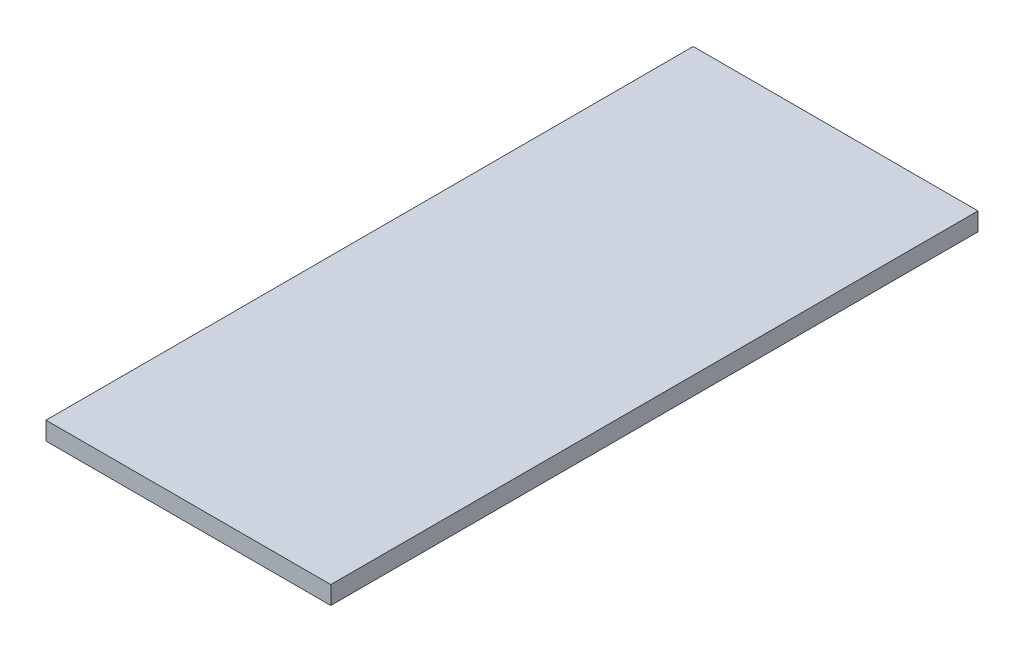
ISO-10303-21;
HEADER;
FILE_DESCRIPTION(('STEP AP214'),'2;1');
FILE_NAME('part.step','',(''),(''),'','','');
FILE_SCHEMA(('AUTOMOTIVE_DESIGN { 1 0 10303 214 1 1 1 1 }'));
ENDSEC;
DATA;
#1=APPLICATION_CONTEXT('core data for automotive mechanical design processes');
#2=APPLICATION_PROTOCOL_DEFINITION('international standard','automotive_design',2000,#1);
#3=PRODUCT_CONTEXT('',#1,'mechanical');
#4=PRODUCT('Part','Part','',(#3));
#5=PRODUCT_RELATED_PRODUCT_CATEGORY('part','',(#4));
#6=PRODUCT_DEFINITION_FORMATION('','',#4);
#7=PRODUCT_DEFINITION_CONTEXT('part definition',#1,'design');
#8=PRODUCT_DEFINITION('design','',#6,#7);
#9=PRODUCT_DEFINITION_SHAPE('','',#8);
#10=(LENGTH_UNIT() NAMED_UNIT(*) SI_UNIT(.MILLI.,.METRE.));
#11=(NAMED_UNIT(*) PLANE_ANGLE_UNIT() SI_UNIT($,.RADIAN.));
#12=(NAMED_UNIT(*) SI_UNIT($,.STERADIAN.) SOLID_ANGLE_UNIT());
#13=UNCERTAINTY_MEASURE_WITH_UNIT(LENGTH_MEASURE(1.E-05),#10,'distance_accuracy_value','');
#14=(GEOMETRIC_REPRESENTATION_CONTEXT(3) GLOBAL_UNCERTAINTY_ASSIGNED_CONTEXT((#13)) GLOBAL_UNIT_ASSIGNED_CONTEXT((#10,
#11,#12)) REPRESENTATION_CONTEXT('',''));
#15=CARTESIAN_POINT('',(0.,0.,0.));
#16=DIRECTION('',(0.,0.,1.));
#17=DIRECTION('',(1.,0.,0.));
#18=AXIS2_PLACEMENT_3D('',#15,#16,#17);
#19=CARTESIAN_POINT('',(-55.,7.,125.));
#20=DIRECTION('',(1.,0.,0.));
#21=DIRECTION('',(0.,0.,-1.));
#22=AXIS2_PLACEMENT_3D('',#19,#20,#21);
#23=PLANE('',#22);
#24=DIRECTION('',(0.,0.,1.));
#25=VECTOR('',#24,1.);
#26=CARTESIAN_POINT('',(-55.,0.,125.));
#27=LINE('',#26,#25);
#28=CARTESIAN_POINT('',(-55.,0.,-125.));
#29=VERTEX_POINT('',#28);
#30=CARTESIAN_POINT('',(-55.,0.,125.));
#31=VERTEX_POINT('',#30);
#32=EDGE_CURVE('E115',#29,#31,#27,.T.);
#33=ORIENTED_EDGE('',*,*,#32,.T.);
#34=DIRECTION('',(0.,-1.,0.));
#35=VECTOR('',#34,1.);
#36=CARTESIAN_POINT('',(-55.,7.,125.));
#37=LINE('',#36,#35);
#38=CARTESIAN_POINT('',(-55.,7.,125.));
#39=VERTEX_POINT('',#38);
#40=EDGE_CURVE('E11',#39,#31,#37,.T.);
#41=ORIENTED_EDGE('',*,*,#40,.F.);
#42=DIRECTION('',(0.,0.,1.));
#43=VECTOR('',#42,1.);
#44=CARTESIAN_POINT('',(-55.,7.,125.));
#45=LINE('',#44,#43);
#46=CARTESIAN_POINT('',(-55.,7.,-125.));
#47=VERTEX_POINT('',#46);
#48=EDGE_CURVE('E92',#47,#39,#45,.T.);
#49=ORIENTED_EDGE('',*,*,#48,.F.);
#50=DIRECTION('',(0.,-1.,0.));
#51=VECTOR('',#50,1.);
#52=CARTESIAN_POINT('',(-55.,7.,-125.));
#53=LINE('',#52,#51);
#54=EDGE_CURVE('E107',#47,#29,#53,.T.);
#55=ORIENTED_EDGE('',*,*,#54,.T.);
#56=EDGE_LOOP('',(#33,#41,#49,#55));
#57=FACE_BOUND('',#56,.T.);
#58=ADVANCED_FACE('F43',(#57),#23,.F.);
#59=CARTESIAN_POINT('',(-55.,7.,125.));
#60=DIRECTION('',(0.,0.,-1.));
#61=DIRECTION('',(-1.,0.,0.));
#62=AXIS2_PLACEMENT_3D('',#59,#60,#61);
#63=PLANE('',#62);
#64=DIRECTION('',(1.,0.,0.));
#65=VECTOR('',#64,1.);
#66=CARTESIAN_POINT('',(-55.,0.,125.));
#67=LINE('',#66,#65);
#68=CARTESIAN_POINT('',(55.,0.,125.));
#69=VERTEX_POINT('',#68);
#70=EDGE_CURVE('E99',#31,#69,#67,.T.);
#71=ORIENTED_EDGE('',*,*,#70,.T.);
#72=DIRECTION('',(0.,-1.,0.));
#73=VECTOR('',#72,1.);
#74=CARTESIAN_POINT('',(55.,7.,125.));
#75=LINE('',#74,#73);
#76=CARTESIAN_POINT('',(55.,7.,125.));
#77=VERTEX_POINT('',#76);
#78=EDGE_CURVE('E55',#77,#69,#75,.T.);
#79=ORIENTED_EDGE('',*,*,#78,.F.);
#80=DIRECTION('',(1.,0.,0.));
#81=VECTOR('',#80,1.);
#82=CARTESIAN_POINT('',(-55.,7.,125.));
#83=LINE('',#82,#81);
#84=EDGE_CURVE('E89',#39,#77,#83,.T.);
#85=ORIENTED_EDGE('',*,*,#84,.F.);
#86=ORIENTED_EDGE('',*,*,#40,.T.);
#87=EDGE_LOOP('',(#71,#79,#85,#86));
#88=FACE_BOUND('',#87,.T.);
#89=ADVANCED_FACE('F97',(#88),#63,.F.);
#90=CARTESIAN_POINT('',(55.,7.,125.));
#91=DIRECTION('',(-1.,0.,0.));
#92=DIRECTION('',(0.,0.,1.));
#93=AXIS2_PLACEMENT_3D('',#90,#91,#92);
#94=PLANE('',#93);
#95=DIRECTION('',(0.,0.,-1.));
#96=VECTOR('',#95,1.);
#97=CARTESIAN_POINT('',(55.,0.,125.));
#98=LINE('',#97,#96);
#99=CARTESIAN_POINT('',(55.,0.,-125.));
#100=VERTEX_POINT('',#99);
#101=EDGE_CURVE('E76',#69,#100,#98,.T.);
#102=ORIENTED_EDGE('',*,*,#101,.T.);
#103=DIRECTION('',(0.,-1.,0.));
#104=VECTOR('',#103,1.);
#105=CARTESIAN_POINT('',(55.,7.,-125.));
#106=LINE('',#105,#104);
#107=CARTESIAN_POINT('',(55.,7.,-125.));
#108=VERTEX_POINT('',#107);
#109=EDGE_CURVE('E105',#108,#100,#106,.T.);
#110=ORIENTED_EDGE('',*,*,#109,.F.);
#111=DIRECTION('',(0.,0.,-1.));
#112=VECTOR('',#111,1.);
#113=CARTESIAN_POINT('',(55.,7.,125.));
#114=LINE('',#113,#112);
#115=EDGE_CURVE('E91',#77,#108,#114,.T.);
#116=ORIENTED_EDGE('',*,*,#115,.F.);
#117=ORIENTED_EDGE('',*,*,#78,.T.);
#118=EDGE_LOOP('',(#102,#110,#116,#117));
#119=FACE_BOUND('',#118,.T.);
#120=ADVANCED_FACE('F103',(#119),#94,.F.);
#121=CARTESIAN_POINT('',(-55.,7.,-125.));
#122=DIRECTION('',(0.,0.,1.));
#123=DIRECTION('',(1.,0.,0.));
#124=AXIS2_PLACEMENT_3D('',#121,#122,#123);
#125=PLANE('',#124);
#126=DIRECTION('',(-1.,0.,0.));
#127=VECTOR('',#126,1.);
#128=CARTESIAN_POINT('',(-55.,0.,-125.));
#129=LINE('',#128,#127);
#130=EDGE_CURVE('E82',#100,#29,#129,.T.);
#131=ORIENTED_EDGE('',*,*,#130,.T.);
#132=ORIENTED_EDGE('',*,*,#54,.F.);
#133=DIRECTION('',(-1.,0.,0.));
#134=VECTOR('',#133,1.);
#135=CARTESIAN_POINT('',(-55.,7.,-125.));
#136=LINE('',#135,#134);
#137=EDGE_CURVE('E58',#108,#47,#136,.T.);
#138=ORIENTED_EDGE('',*,*,#137,.F.);
#139=ORIENTED_EDGE('',*,*,#109,.T.);
#140=EDGE_LOOP('',(#131,#132,#138,#139));
#141=FACE_BOUND('',#140,.T.);
#142=ADVANCED_FACE('F124',(#141),#125,.F.);
#143=CARTESIAN_POINT('',(0.,7.,0.));
#144=DIRECTION('',(0.,-1.,0.));
#145=DIRECTION('',(0.,0.,-1.));
#146=AXIS2_PLACEMENT_3D('',#143,#144,#145);
#147=PLANE('',#146);
#148=ORIENTED_EDGE('',*,*,#48,.T.);
#149=ORIENTED_EDGE('',*,*,#84,.T.);
#150=ORIENTED_EDGE('',*,*,#115,.T.);
#151=ORIENTED_EDGE('',*,*,#137,.T.);
#152=EDGE_LOOP('',(#148,#149,#150,#151));
#153=FACE_BOUND('',#152,.T.);
#154=ADVANCED_FACE('F93',(#153),#147,.F.);
#155=CARTESIAN_POINT('',(0.,0.,0.));
#156=DIRECTION('',(0.,-1.,0.));
#157=DIRECTION('',(0.,0.,-1.));
#158=AXIS2_PLACEMENT_3D('',#155,#156,#157);
#159=PLANE('',#158);
#160=ORIENTED_EDGE('',*,*,#32,.F.);
#161=ORIENTED_EDGE('',*,*,#130,.F.);
#162=ORIENTED_EDGE('',*,*,#101,.F.);
#163=ORIENTED_EDGE('',*,*,#70,.F.);
#164=EDGE_LOOP('',(#160,#161,#162,#163));
#165=FACE_BOUND('',#164,.T.);
#166=ADVANCED_FACE('F126',(#165),#159,.T.);
#167=CLOSED_SHELL('',(#58,#89,#120,#142,#154,#166));
#168=MANIFOLD_SOLID_BREP('B2',#167);
#169=ADVANCED_BREP_SHAPE_REPRESENTATION('',(#18,#168),#14);
#170=SHAPE_DEFINITION_REPRESENTATION(#9,#169);
ENDSEC;
END-ISO-10303-21;
